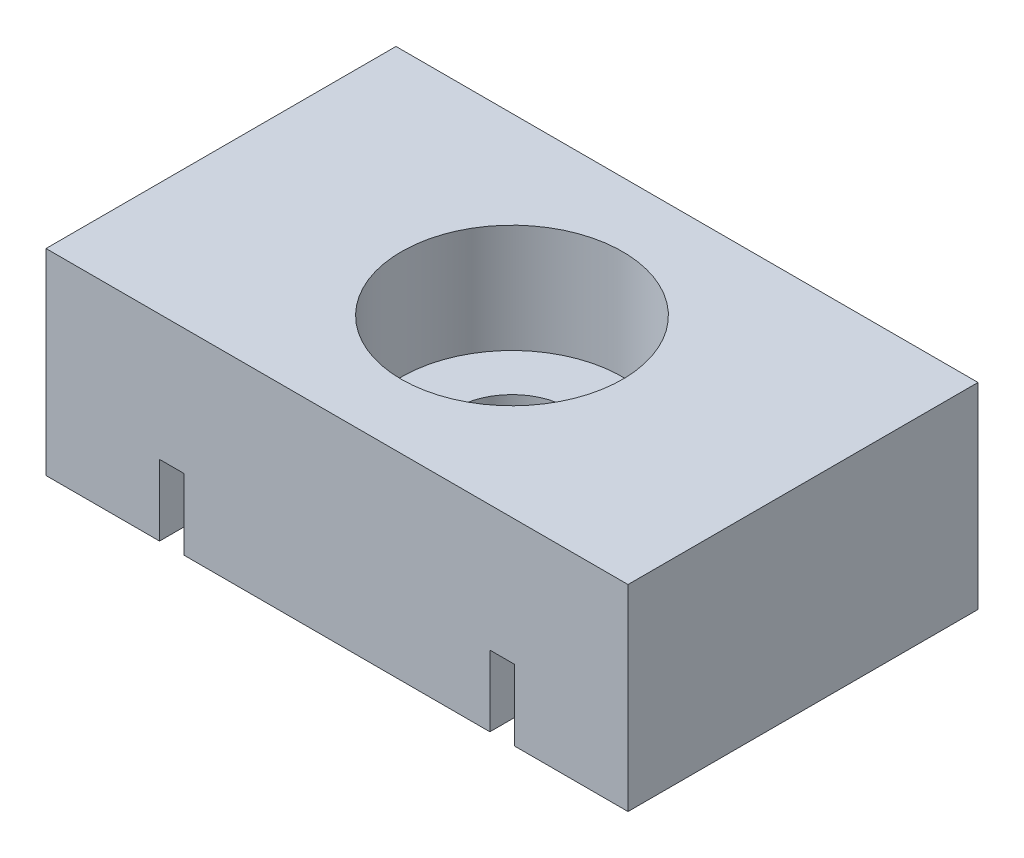
ISO-10303-21;
HEADER;
FILE_DESCRIPTION(('STEP AP214'),'2;1');
FILE_NAME('part.step','',(''),(''),'','','');
FILE_SCHEMA(('AUTOMOTIVE_DESIGN { 1 0 10303 214 1 1 1 1 }'));
ENDSEC;
DATA;
#1=APPLICATION_CONTEXT('core data for automotive mechanical design processes');
#2=APPLICATION_PROTOCOL_DEFINITION('international standard','automotive_design',2000,#1);
#3=PRODUCT_CONTEXT('',#1,'mechanical');
#4=PRODUCT('Part','Part','',(#3));
#5=PRODUCT_RELATED_PRODUCT_CATEGORY('part','',(#4));
#6=PRODUCT_DEFINITION_FORMATION('','',#4);
#7=PRODUCT_DEFINITION_CONTEXT('part definition',#1,'design');
#8=PRODUCT_DEFINITION('design','',#6,#7);
#9=PRODUCT_DEFINITION_SHAPE('','',#8);
#10=(LENGTH_UNIT() NAMED_UNIT(*) SI_UNIT(.MILLI.,.METRE.));
#11=(NAMED_UNIT(*) PLANE_ANGLE_UNIT() SI_UNIT($,.RADIAN.));
#12=(NAMED_UNIT(*) SI_UNIT($,.STERADIAN.) SOLID_ANGLE_UNIT());
#13=UNCERTAINTY_MEASURE_WITH_UNIT(LENGTH_MEASURE(1.E-05),#10,'distance_accuracy_value','');
#14=(GEOMETRIC_REPRESENTATION_CONTEXT(3) GLOBAL_UNCERTAINTY_ASSIGNED_CONTEXT((#13)) GLOBAL_UNIT_ASSIGNED_CONTEXT((#10,
#11,#12)) REPRESENTATION_CONTEXT('',''));
#15=CARTESIAN_POINT('',(0.,0.,0.));
#16=DIRECTION('',(0.,0.,1.));
#17=DIRECTION('',(1.,0.,0.));
#18=AXIS2_PLACEMENT_3D('',#15,#16,#17);
#19=CARTESIAN_POINT('',(9.398,6.35,5.6515));
#20=DIRECTION('',(-1.,0.,0.));
#21=DIRECTION('',(0.,0.,1.));
#22=AXIS2_PLACEMENT_3D('',#19,#20,#21);
#23=PLANE('',#22);
#24=DIRECTION('',(0.,0.,-1.));
#25=VECTOR('',#24,1.);
#26=CARTESIAN_POINT('',(9.398,0.,5.6515));
#27=LINE('',#26,#25);
#28=CARTESIAN_POINT('',(9.398,0.,5.6515));
#29=VERTEX_POINT('',#28);
#30=CARTESIAN_POINT('',(9.398,0.,-5.6515));
#31=VERTEX_POINT('',#30);
#32=EDGE_CURVE('E168',#29,#31,#27,.T.);
#33=ORIENTED_EDGE('',*,*,#32,.T.);
#34=DIRECTION('',(0.,-1.,0.));
#35=VECTOR('',#34,1.);
#36=CARTESIAN_POINT('',(9.398,6.35,-5.6515));
#37=LINE('',#36,#35);
#38=CARTESIAN_POINT('',(9.398,6.35,-5.6515));
#39=VERTEX_POINT('',#38);
#40=EDGE_CURVE('E202',#39,#31,#37,.T.);
#41=ORIENTED_EDGE('',*,*,#40,.F.);
#42=DIRECTION('',(0.,0.,-1.));
#43=VECTOR('',#42,1.);
#44=CARTESIAN_POINT('',(9.398,6.35,5.6515));
#45=LINE('',#44,#43);
#46=CARTESIAN_POINT('',(9.398,6.35,5.6515));
#47=VERTEX_POINT('',#46);
#48=EDGE_CURVE('E174',#47,#39,#45,.T.);
#49=ORIENTED_EDGE('',*,*,#48,.F.);
#50=DIRECTION('',(0.,-1.,0.));
#51=VECTOR('',#50,1.);
#52=CARTESIAN_POINT('',(9.398,6.35,5.6515));
#53=LINE('',#52,#51);
#54=EDGE_CURVE('E184',#47,#29,#53,.T.);
#55=ORIENTED_EDGE('',*,*,#54,.T.);
#56=EDGE_LOOP('',(#33,#41,#49,#55));
#57=FACE_BOUND('',#56,.T.);
#58=ADVANCED_FACE('F33',(#57),#23,.F.);
#59=CARTESIAN_POINT('',(-9.398,6.35,-5.6515));
#60=DIRECTION('',(0.,0.,1.));
#61=DIRECTION('',(1.,0.,0.));
#62=AXIS2_PLACEMENT_3D('',#59,#60,#61);
#63=PLANE('',#62);
#64=DIRECTION('',(-1.,0.,0.));
#65=VECTOR('',#64,1.);
#66=CARTESIAN_POINT('',(-9.398,0.,-5.6515));
#67=LINE('',#66,#65);
#68=CARTESIAN_POINT('',(-9.398,0.,-5.6515));
#69=VERTEX_POINT('',#68);
#70=EDGE_CURVE('E187',#31,#69,#67,.T.);
#71=ORIENTED_EDGE('',*,*,#70,.T.);
#72=DIRECTION('',(0.,-1.,0.));
#73=VECTOR('',#72,1.);
#74=CARTESIAN_POINT('',(-9.398,6.35,-5.6515));
#75=LINE('',#74,#73);
#76=CARTESIAN_POINT('',(-9.398,6.35,-5.6515));
#77=VERTEX_POINT('',#76);
#78=EDGE_CURVE('E199',#77,#69,#75,.T.);
#79=ORIENTED_EDGE('',*,*,#78,.F.);
#80=DIRECTION('',(-1.,0.,0.));
#81=VECTOR('',#80,1.);
#82=CARTESIAN_POINT('',(-9.398,6.35,-5.6515));
#83=LINE('',#82,#81);
#84=EDGE_CURVE('E177',#39,#77,#83,.T.);
#85=ORIENTED_EDGE('',*,*,#84,.F.);
#86=ORIENTED_EDGE('',*,*,#40,.T.);
#87=EDGE_LOOP('',(#71,#79,#85,#86));
#88=FACE_BOUND('',#87,.T.);
#89=ADVANCED_FACE('F233',(#88),#63,.F.);
#90=CARTESIAN_POINT('',(-9.398,6.35,5.6515));
#91=DIRECTION('',(1.,0.,0.));
#92=DIRECTION('',(0.,0.,-1.));
#93=AXIS2_PLACEMENT_3D('',#90,#91,#92);
#94=PLANE('',#93);
#95=DIRECTION('',(0.,0.,1.));
#96=VECTOR('',#95,1.);
#97=CARTESIAN_POINT('',(-9.398,0.,5.6515));
#98=LINE('',#97,#96);
#99=CARTESIAN_POINT('',(-9.398,0.,5.6515));
#100=VERTEX_POINT('',#99);
#101=EDGE_CURVE('E189',#69,#100,#98,.T.);
#102=ORIENTED_EDGE('',*,*,#101,.T.);
#103=DIRECTION('',(0.,-1.,0.));
#104=VECTOR('',#103,1.);
#105=CARTESIAN_POINT('',(-9.398,6.35,5.6515));
#106=LINE('',#105,#104);
#107=CARTESIAN_POINT('',(-9.398,6.35,5.6515));
#108=VERTEX_POINT('',#107);
#109=EDGE_CURVE('E196',#108,#100,#106,.T.);
#110=ORIENTED_EDGE('',*,*,#109,.F.);
#111=DIRECTION('',(0.,0.,1.));
#112=VECTOR('',#111,1.);
#113=CARTESIAN_POINT('',(-9.398,6.35,5.6515));
#114=LINE('',#113,#112);
#115=EDGE_CURVE('E180',#77,#108,#114,.T.);
#116=ORIENTED_EDGE('',*,*,#115,.F.);
#117=ORIENTED_EDGE('',*,*,#78,.T.);
#118=EDGE_LOOP('',(#102,#110,#116,#117));
#119=FACE_BOUND('',#118,.T.);
#120=ADVANCED_FACE('F238',(#119),#94,.F.);
#121=CARTESIAN_POINT('',(-9.398,6.35,5.6515));
#122=DIRECTION('',(0.,0.,-1.));
#123=DIRECTION('',(-1.,0.,0.));
#124=AXIS2_PLACEMENT_3D('',#121,#122,#123);
#125=PLANE('',#124);
#126=DIRECTION('',(-1.,0.,0.));
#127=VECTOR('',#126,1.);
#128=CARTESIAN_POINT('',(-9.398,2.286,5.6515));
#129=LINE('',#128,#127);
#130=CARTESIAN_POINT('',(5.730875,2.286,5.6515));
#131=VERTEX_POINT('',#130);
#132=CARTESIAN_POINT('',(4.937125,2.286,5.6515));
#133=VERTEX_POINT('',#132);
#134=EDGE_CURVE('E11',#131,#133,#129,.T.);
#135=ORIENTED_EDGE('',*,*,#134,.F.);
#136=DIRECTION('',(0.,-1.,0.));
#137=VECTOR('',#136,1.);
#138=CARTESIAN_POINT('',(5.730875,2.286,5.6515));
#139=LINE('',#138,#137);
#140=CARTESIAN_POINT('',(5.730875,0.,5.6515));
#141=VERTEX_POINT('',#140);
#142=EDGE_CURVE('E162',#131,#141,#139,.T.);
#143=ORIENTED_EDGE('',*,*,#142,.T.);
#144=DIRECTION('',(1.,0.,0.));
#145=VECTOR('',#144,1.);
#146=CARTESIAN_POINT('',(-9.398,0.,5.6515));
#147=LINE('',#146,#145);
#148=EDGE_CURVE('E191',#141,#29,#147,.T.);
#149=ORIENTED_EDGE('',*,*,#148,.T.);
#150=ORIENTED_EDGE('',*,*,#54,.F.);
#151=DIRECTION('',(1.,0.,0.));
#152=VECTOR('',#151,1.);
#153=CARTESIAN_POINT('',(-9.398,6.35,5.6515));
#154=LINE('',#153,#152);
#155=EDGE_CURVE('E182',#108,#47,#154,.T.);
#156=ORIENTED_EDGE('',*,*,#155,.F.);
#157=ORIENTED_EDGE('',*,*,#109,.T.);
#158=CARTESIAN_POINT('',(-5.730875,0.,5.6515));
#159=VERTEX_POINT('',#158);
#160=EDGE_CURVE('E178',#100,#159,#147,.T.);
#161=ORIENTED_EDGE('',*,*,#160,.T.);
#162=DIRECTION('',(0.,-1.,0.));
#163=VECTOR('',#162,1.);
#164=CARTESIAN_POINT('',(-5.730875,2.286,5.6515));
#165=LINE('',#164,#163);
#166=CARTESIAN_POINT('',(-5.730875,2.286,5.6515));
#167=VERTEX_POINT('',#166);
#168=EDGE_CURVE('E55',#167,#159,#165,.T.);
#169=ORIENTED_EDGE('',*,*,#168,.F.);
#170=DIRECTION('',(-1.,0.,0.));
#171=VECTOR('',#170,1.);
#172=CARTESIAN_POINT('',(-9.398,2.286,5.6515));
#173=LINE('',#172,#171);
#174=CARTESIAN_POINT('',(-4.937125,2.286,5.6515));
#175=VERTEX_POINT('',#174);
#176=EDGE_CURVE('E40',#175,#167,#173,.T.);
#177=ORIENTED_EDGE('',*,*,#176,.F.);
#178=DIRECTION('',(0.,-1.,0.));
#179=VECTOR('',#178,1.);
#180=CARTESIAN_POINT('',(-4.937125,2.286,5.6515));
#181=LINE('',#180,#179);
#182=CARTESIAN_POINT('',(-4.937125,0.,5.6515));
#183=VERTEX_POINT('',#182);
#184=EDGE_CURVE('E166',#175,#183,#181,.T.);
#185=ORIENTED_EDGE('',*,*,#184,.T.);
#186=CARTESIAN_POINT('',(4.937125,0.,5.6515));
#187=VERTEX_POINT('',#186);
#188=EDGE_CURVE('E142',#183,#187,#147,.T.);
#189=ORIENTED_EDGE('',*,*,#188,.T.);
#190=DIRECTION('',(0.,-1.,0.));
#191=VECTOR('',#190,1.);
#192=CARTESIAN_POINT('',(4.937125,2.286,5.6515));
#193=LINE('',#192,#191);
#194=EDGE_CURVE('E47',#133,#187,#193,.T.);
#195=ORIENTED_EDGE('',*,*,#194,.F.);
#196=EDGE_LOOP('',(#135,#143,#149,#150,#156,#157,#161,#169,#177,#185,#189,#195));
#197=FACE_BOUND('',#196,.T.);
#198=ADVANCED_FACE('F139',(#197),#125,.F.);
#199=CARTESIAN_POINT('',(0.,6.35,0.));
#200=DIRECTION('',(0.,-1.,0.));
#201=DIRECTION('',(0.,0.,-1.));
#202=AXIS2_PLACEMENT_3D('',#199,#200,#201);
#203=PLANE('',#202);
#204=CARTESIAN_POINT('',(0.,6.35,0.));
#205=DIRECTION('',(0.,1.,0.));
#206=DIRECTION('',(0.,0.,1.));
#207=AXIS2_PLACEMENT_3D('',#204,#205,#206);
#208=CIRCLE('',#207,3.57250999999999);
#209=CARTESIAN_POINT('',(0.,6.35,3.57250999999999));
#210=VERTEX_POINT('',#209);
#211=EDGE_CURVE('E389',#210,#210,#208,.T.);
#212=ORIENTED_EDGE('',*,*,#211,.F.);
#213=EDGE_LOOP('',(#212));
#214=FACE_BOUND('',#213,.T.);
#215=ORIENTED_EDGE('',*,*,#48,.T.);
#216=ORIENTED_EDGE('',*,*,#84,.T.);
#217=ORIENTED_EDGE('',*,*,#115,.T.);
#218=ORIENTED_EDGE('',*,*,#155,.T.);
#219=EDGE_LOOP('',(#215,#216,#217,#218));
#220=FACE_BOUND('',#219,.T.);
#221=ADVANCED_FACE('F236',(#214,#220),#203,.F.);
#222=CARTESIAN_POINT('',(0.,0.,0.));
#223=DIRECTION('',(0.,-1.,0.));
#224=DIRECTION('',(0.,0.,-1.));
#225=AXIS2_PLACEMENT_3D('',#222,#223,#224);
#226=PLANE('',#225);
#227=CARTESIAN_POINT('',(0.,0.,0.));
#228=DIRECTION('',(0.,1.,0.));
#229=DIRECTION('',(0.,0.,1.));
#230=AXIS2_PLACEMENT_3D('',#227,#228,#229);
#231=CIRCLE('',#230,1.82880000000001);
#232=CARTESIAN_POINT('',(0.,0.,1.82880000000001));
#233=VERTEX_POINT('',#232);
#234=EDGE_CURVE('E396',#233,#233,#231,.T.);
#235=ORIENTED_EDGE('',*,*,#234,.T.);
#236=EDGE_LOOP('',(#235));
#237=FACE_BOUND('',#236,.T.);
#238=DIRECTION('',(0.,0.,1.));
#239=VECTOR('',#238,1.);
#240=CARTESIAN_POINT('',(5.730875,0.,5.6515));
#241=LINE('',#240,#239);
#242=CARTESIAN_POINT('',(5.730875,0.,4.1783));
#243=VERTEX_POINT('',#242);
#244=EDGE_CURVE('E136',#243,#141,#241,.T.);
#245=ORIENTED_EDGE('',*,*,#244,.F.);
#246=CARTESIAN_POINT('',(5.334,0.,4.1783));
#247=DIRECTION('',(0.,-1.,0.));
#248=DIRECTION('',(0.,0.,-1.));
#249=AXIS2_PLACEMENT_3D('',#246,#247,#248);
#250=CIRCLE('',#249,0.396875);
#251=CARTESIAN_POINT('',(4.937125,0.,4.1783));
#252=VERTEX_POINT('',#251);
#253=EDGE_CURVE('E401',#252,#243,#250,.T.);
#254=ORIENTED_EDGE('',*,*,#253,.F.);
#255=DIRECTION('',(0.,0.,-1.));
#256=VECTOR('',#255,1.);
#257=CARTESIAN_POINT('',(4.937125,0.,5.6515));
#258=LINE('',#257,#256);
#259=EDGE_CURVE('E224',#187,#252,#258,.T.);
#260=ORIENTED_EDGE('',*,*,#259,.F.);
#261=ORIENTED_EDGE('',*,*,#188,.F.);
#262=DIRECTION('',(0.,0.,1.));
#263=VECTOR('',#262,1.);
#264=CARTESIAN_POINT('',(-4.937125,0.,5.6515));
#265=LINE('',#264,#263);
#266=CARTESIAN_POINT('',(-4.937125,0.,4.1783));
#267=VERTEX_POINT('',#266);
#268=EDGE_CURVE('E153',#267,#183,#265,.T.);
#269=ORIENTED_EDGE('',*,*,#268,.F.);
#270=CARTESIAN_POINT('',(-5.334,0.,4.1783));
#271=DIRECTION('',(0.,-1.,0.));
#272=DIRECTION('',(0.,0.,-1.));
#273=AXIS2_PLACEMENT_3D('',#270,#271,#272);
#274=CIRCLE('',#273,0.396875);
#275=CARTESIAN_POINT('',(-5.730875,0.,4.1783));
#276=VERTEX_POINT('',#275);
#277=EDGE_CURVE('E161',#276,#267,#274,.T.);
#278=ORIENTED_EDGE('',*,*,#277,.F.);
#279=DIRECTION('',(0.,0.,-1.));
#280=VECTOR('',#279,1.);
#281=CARTESIAN_POINT('',(-5.730875,0.,5.6515));
#282=LINE('',#281,#280);
#283=EDGE_CURVE('E159',#159,#276,#282,.T.);
#284=ORIENTED_EDGE('',*,*,#283,.F.);
#285=ORIENTED_EDGE('',*,*,#160,.F.);
#286=ORIENTED_EDGE('',*,*,#101,.F.);
#287=ORIENTED_EDGE('',*,*,#70,.F.);
#288=ORIENTED_EDGE('',*,*,#32,.F.);
#289=ORIENTED_EDGE('',*,*,#148,.F.);
#290=EDGE_LOOP('',(#245,#254,#260,#261,#269,#278,#284,#285,#286,#287,#288,#289));
#291=FACE_BOUND('',#290,.T.);
#292=ADVANCED_FACE('F216',(#237,#291),#226,.T.);
#293=CARTESIAN_POINT('',(-5.334,2.286,5.6515));
#294=DIRECTION('',(0.,-1.,0.));
#295=DIRECTION('',(0.,0.,-1.));
#296=AXIS2_PLACEMENT_3D('',#293,#294,#295);
#297=PLANE('',#296);
#298=ORIENTED_EDGE('',*,*,#176,.T.);
#299=DIRECTION('',(0.,0.,-1.));
#300=VECTOR('',#299,1.);
#301=CARTESIAN_POINT('',(-5.730875,2.286,5.6515));
#302=LINE('',#301,#300);
#303=CARTESIAN_POINT('',(-5.730875,2.286,4.1783));
#304=VERTEX_POINT('',#303);
#305=EDGE_CURVE('E149',#167,#304,#302,.T.);
#306=ORIENTED_EDGE('',*,*,#305,.T.);
#307=CARTESIAN_POINT('',(-5.334,2.286,4.1783));
#308=DIRECTION('',(0.,-1.,0.));
#309=DIRECTION('',(0.,0.,-1.));
#310=AXIS2_PLACEMENT_3D('',#307,#308,#309);
#311=CIRCLE('',#310,0.396875);
#312=CARTESIAN_POINT('',(-4.937125,2.286,4.1783));
#313=VERTEX_POINT('',#312);
#314=EDGE_CURVE('E152',#304,#313,#311,.T.);
#315=ORIENTED_EDGE('',*,*,#314,.T.);
#316=DIRECTION('',(0.,0.,1.));
#317=VECTOR('',#316,1.);
#318=CARTESIAN_POINT('',(-4.937125,2.286,5.6515));
#319=LINE('',#318,#317);
#320=EDGE_CURVE('E156',#313,#175,#319,.T.);
#321=ORIENTED_EDGE('',*,*,#320,.T.);
#322=EDGE_LOOP('',(#298,#306,#315,#321));
#323=FACE_BOUND('',#322,.T.);
#324=ADVANCED_FACE('F206',(#323),#297,.T.);
#325=CARTESIAN_POINT('',(-4.937125,2.286,5.6515));
#326=DIRECTION('',(1.,0.,0.));
#327=DIRECTION('',(0.,0.,-1.));
#328=AXIS2_PLACEMENT_3D('',#325,#326,#327);
#329=PLANE('',#328);
#330=ORIENTED_EDGE('',*,*,#268,.T.);
#331=ORIENTED_EDGE('',*,*,#184,.F.);
#332=ORIENTED_EDGE('',*,*,#320,.F.);
#333=DIRECTION('',(0.,-1.,0.));
#334=VECTOR('',#333,1.);
#335=CARTESIAN_POINT('',(-4.937125,2.286,4.1783));
#336=LINE('',#335,#334);
#337=EDGE_CURVE('E169',#313,#267,#336,.T.);
#338=ORIENTED_EDGE('',*,*,#337,.T.);
#339=EDGE_LOOP('',(#330,#331,#332,#338));
#340=FACE_BOUND('',#339,.T.);
#341=ADVANCED_FACE('F222',(#340),#329,.F.);
#342=CARTESIAN_POINT('',(-5.334,2.286,4.1783));
#343=DIRECTION('',(0.,-1.,0.));
#344=DIRECTION('',(0.,0.,-1.));
#345=AXIS2_PLACEMENT_3D('',#342,#343,#344);
#346=CYLINDRICAL_SURFACE('',#345,0.396875);
#347=ORIENTED_EDGE('',*,*,#277,.T.);
#348=ORIENTED_EDGE('',*,*,#337,.F.);
#349=ORIENTED_EDGE('',*,*,#314,.F.);
#350=DIRECTION('',(0.,-1.,0.));
#351=VECTOR('',#350,1.);
#352=CARTESIAN_POINT('',(-5.730875,2.286,4.1783));
#353=LINE('',#352,#351);
#354=EDGE_CURVE('E171',#304,#276,#353,.T.);
#355=ORIENTED_EDGE('',*,*,#354,.T.);
#356=EDGE_LOOP('',(#347,#348,#349,#355));
#357=FACE_BOUND('',#356,.T.);
#358=ADVANCED_FACE('F220',(#357),#346,.F.);
#359=CARTESIAN_POINT('',(-5.730875,2.286,5.6515));
#360=DIRECTION('',(-1.,0.,0.));
#361=DIRECTION('',(0.,0.,1.));
#362=AXIS2_PLACEMENT_3D('',#359,#360,#361);
#363=PLANE('',#362);
#364=ORIENTED_EDGE('',*,*,#283,.T.);
#365=ORIENTED_EDGE('',*,*,#354,.F.);
#366=ORIENTED_EDGE('',*,*,#305,.F.);
#367=ORIENTED_EDGE('',*,*,#168,.T.);
#368=EDGE_LOOP('',(#364,#365,#366,#367));
#369=FACE_BOUND('',#368,.T.);
#370=ADVANCED_FACE('F208',(#369),#363,.F.);
#371=CARTESIAN_POINT('',(5.334,2.286,5.6515));
#372=DIRECTION('',(0.,-1.,0.));
#373=DIRECTION('',(0.,0.,-1.));
#374=AXIS2_PLACEMENT_3D('',#371,#372,#373);
#375=PLANE('',#374);
#376=ORIENTED_EDGE('',*,*,#134,.T.);
#377=DIRECTION('',(0.,0.,-1.));
#378=VECTOR('',#377,1.);
#379=CARTESIAN_POINT('',(4.937125,2.286,5.6515));
#380=LINE('',#379,#378);
#381=CARTESIAN_POINT('',(4.937125,2.286,4.1783));
#382=VERTEX_POINT('',#381);
#383=EDGE_CURVE('E127',#133,#382,#380,.T.);
#384=ORIENTED_EDGE('',*,*,#383,.T.);
#385=CARTESIAN_POINT('',(5.334,2.286,4.1783));
#386=DIRECTION('',(0.,-1.,0.));
#387=DIRECTION('',(0.,0.,-1.));
#388=AXIS2_PLACEMENT_3D('',#385,#386,#387);
#389=CIRCLE('',#388,0.396875);
#390=CARTESIAN_POINT('',(5.730875,2.286,4.1783));
#391=VERTEX_POINT('',#390);
#392=EDGE_CURVE('E135',#382,#391,#389,.T.);
#393=ORIENTED_EDGE('',*,*,#392,.T.);
#394=DIRECTION('',(0.,0.,1.));
#395=VECTOR('',#394,1.);
#396=CARTESIAN_POINT('',(5.730875,2.286,5.6515));
#397=LINE('',#396,#395);
#398=EDGE_CURVE('E129',#391,#131,#397,.T.);
#399=ORIENTED_EDGE('',*,*,#398,.T.);
#400=EDGE_LOOP('',(#376,#384,#393,#399));
#401=FACE_BOUND('',#400,.T.);
#402=ADVANCED_FACE('F125',(#401),#375,.T.);
#403=CARTESIAN_POINT('',(5.730875,2.286,5.6515));
#404=DIRECTION('',(1.,0.,0.));
#405=DIRECTION('',(0.,0.,-1.));
#406=AXIS2_PLACEMENT_3D('',#403,#404,#405);
#407=PLANE('',#406);
#408=ORIENTED_EDGE('',*,*,#244,.T.);
#409=ORIENTED_EDGE('',*,*,#142,.F.);
#410=ORIENTED_EDGE('',*,*,#398,.F.);
#411=DIRECTION('',(0.,-1.,0.));
#412=VECTOR('',#411,1.);
#413=CARTESIAN_POINT('',(5.730875,2.286,4.1783));
#414=LINE('',#413,#412);
#415=EDGE_CURVE('E144',#391,#243,#414,.T.);
#416=ORIENTED_EDGE('',*,*,#415,.T.);
#417=EDGE_LOOP('',(#408,#409,#410,#416));
#418=FACE_BOUND('',#417,.T.);
#419=ADVANCED_FACE('F308',(#418),#407,.F.);
#420=CARTESIAN_POINT('',(5.334,2.286,4.1783));
#421=DIRECTION('',(0.,-1.,0.));
#422=DIRECTION('',(0.,0.,-1.));
#423=AXIS2_PLACEMENT_3D('',#420,#421,#422);
#424=CYLINDRICAL_SURFACE('',#423,0.396875);
#425=ORIENTED_EDGE('',*,*,#253,.T.);
#426=ORIENTED_EDGE('',*,*,#415,.F.);
#427=ORIENTED_EDGE('',*,*,#392,.F.);
#428=DIRECTION('',(0.,-1.,0.));
#429=VECTOR('',#428,1.);
#430=CARTESIAN_POINT('',(4.937125,2.286,4.1783));
#431=LINE('',#430,#429);
#432=EDGE_CURVE('E133',#382,#252,#431,.T.);
#433=ORIENTED_EDGE('',*,*,#432,.T.);
#434=EDGE_LOOP('',(#425,#426,#427,#433));
#435=FACE_BOUND('',#434,.T.);
#436=ADVANCED_FACE('F317',(#435),#424,.F.);
#437=CARTESIAN_POINT('',(4.937125,2.286,5.6515));
#438=DIRECTION('',(-1.,0.,0.));
#439=DIRECTION('',(0.,0.,1.));
#440=AXIS2_PLACEMENT_3D('',#437,#438,#439);
#441=PLANE('',#440);
#442=ORIENTED_EDGE('',*,*,#259,.T.);
#443=ORIENTED_EDGE('',*,*,#432,.F.);
#444=ORIENTED_EDGE('',*,*,#383,.F.);
#445=ORIENTED_EDGE('',*,*,#194,.T.);
#446=EDGE_LOOP('',(#442,#443,#444,#445));
#447=FACE_BOUND('',#446,.T.);
#448=ADVANCED_FACE('F132',(#447),#441,.F.);
#449=CARTESIAN_POINT('',(0.,6.35,0.));
#450=DIRECTION('',(0.,1.,0.));
#451=DIRECTION('',(0.,0.,1.));
#452=AXIS2_PLACEMENT_3D('',#449,#450,#451);
#453=CYLINDRICAL_SURFACE('',#452,1.8288);
#454=ORIENTED_EDGE('',*,*,#234,.F.);
#455=EDGE_LOOP('',(#454));
#456=FACE_BOUND('',#455,.T.);
#457=CARTESIAN_POINT('',(0.,2.8448,0.));
#458=DIRECTION('',(0.,1.,0.));
#459=DIRECTION('',(0.,0.,1.));
#460=AXIS2_PLACEMENT_3D('',#457,#458,#459);
#461=CIRCLE('',#460,1.8288);
#462=CARTESIAN_POINT('',(0.,2.8448,1.8288));
#463=VERTEX_POINT('',#462);
#464=EDGE_CURVE('E391',#463,#463,#461,.T.);
#465=ORIENTED_EDGE('',*,*,#464,.T.);
#466=EDGE_LOOP('',(#465));
#467=FACE_BOUND('',#466,.T.);
#468=ADVANCED_FACE('F336',(#456,#467),#453,.F.);
#469=CARTESIAN_POINT('',(1.8288,2.8448,0.));
#470=DIRECTION('',(0.,-1.,0.));
#471=DIRECTION('',(0.,0.,-1.));
#472=AXIS2_PLACEMENT_3D('',#469,#470,#471);
#473=PLANE('',#472);
#474=ORIENTED_EDGE('',*,*,#464,.F.);
#475=EDGE_LOOP('',(#474));
#476=FACE_BOUND('',#475,.T.);
#477=CARTESIAN_POINT('',(0.,2.8448,0.));
#478=DIRECTION('',(0.,1.,0.));
#479=DIRECTION('',(0.,0.,1.));
#480=AXIS2_PLACEMENT_3D('',#477,#478,#479);
#481=CIRCLE('',#480,3.57251);
#482=CARTESIAN_POINT('',(0.,2.8448,3.57251));
#483=VERTEX_POINT('',#482);
#484=EDGE_CURVE('E386',#483,#483,#481,.T.);
#485=ORIENTED_EDGE('',*,*,#484,.T.);
#486=EDGE_LOOP('',(#485));
#487=FACE_BOUND('',#486,.T.);
#488=ADVANCED_FACE('F359',(#476,#487),#473,.F.);
#489=CARTESIAN_POINT('',(0.,6.35,0.));
#490=DIRECTION('',(0.,1.,0.));
#491=DIRECTION('',(0.,0.,1.));
#492=AXIS2_PLACEMENT_3D('',#489,#490,#491);
#493=CYLINDRICAL_SURFACE('',#492,3.57250999999999);
#494=ORIENTED_EDGE('',*,*,#484,.F.);
#495=EDGE_LOOP('',(#494));
#496=FACE_BOUND('',#495,.T.);
#497=ORIENTED_EDGE('',*,*,#211,.T.);
#498=EDGE_LOOP('',(#497));
#499=FACE_BOUND('',#498,.T.);
#500=ADVANCED_FACE('F369',(#496,#499),#493,.F.);
#501=CLOSED_SHELL('',(#58,#89,#120,#198,#221,#292,#324,#341,#358,#370,#402,#419,#436,#448,#468,
#488,#500));
#502=MANIFOLD_SOLID_BREP('B2',#501);
#503=ADVANCED_BREP_SHAPE_REPRESENTATION('',(#18,#502),#14);
#504=SHAPE_DEFINITION_REPRESENTATION(#9,#503);
ENDSEC;
END-ISO-10303-21;
